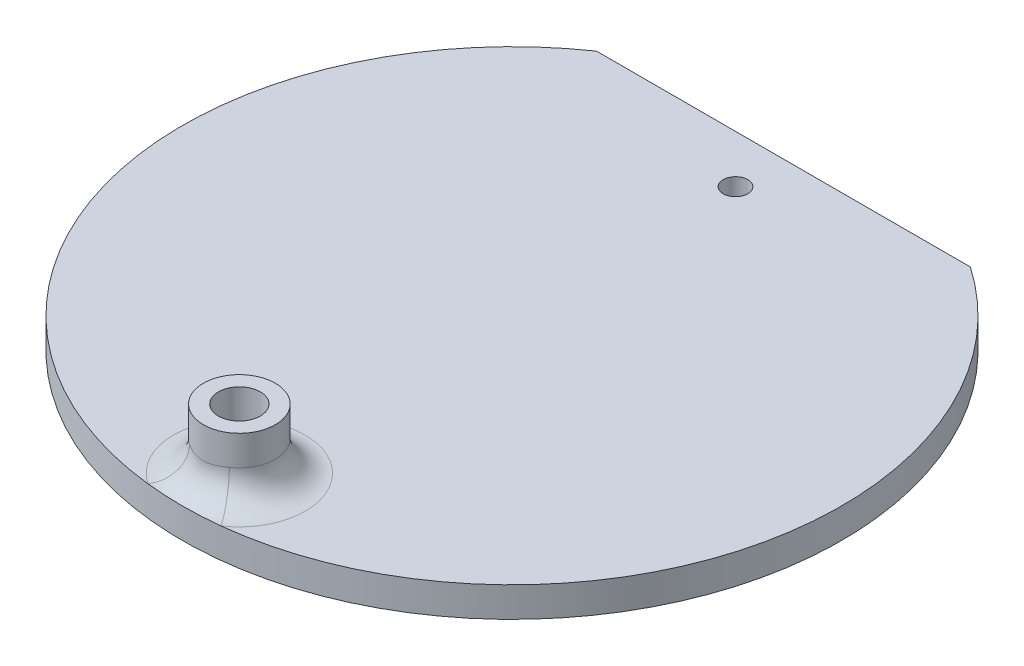
ISO-10303-21;
HEADER;
FILE_DESCRIPTION(('STEP AP214'),'2;1');
FILE_NAME('part.step','',(''),(''),'','','');
FILE_SCHEMA(('AUTOMOTIVE_DESIGN { 1 0 10303 214 1 1 1 1 }'));
ENDSEC;
DATA;
#1=APPLICATION_CONTEXT('core data for automotive mechanical design processes');
#2=APPLICATION_PROTOCOL_DEFINITION('international standard','automotive_design',2000,#1);
#3=PRODUCT_CONTEXT('',#1,'mechanical');
#4=PRODUCT('Part','Part','',(#3));
#5=PRODUCT_RELATED_PRODUCT_CATEGORY('part','',(#4));
#6=PRODUCT_DEFINITION_FORMATION('','',#4);
#7=PRODUCT_DEFINITION_CONTEXT('part definition',#1,'design');
#8=PRODUCT_DEFINITION('design','',#6,#7);
#9=PRODUCT_DEFINITION_SHAPE('','',#8);
#10=(LENGTH_UNIT() NAMED_UNIT(*) SI_UNIT(.MILLI.,.METRE.));
#11=(NAMED_UNIT(*) PLANE_ANGLE_UNIT() SI_UNIT($,.RADIAN.));
#12=(NAMED_UNIT(*) SI_UNIT($,.STERADIAN.) SOLID_ANGLE_UNIT());
#13=UNCERTAINTY_MEASURE_WITH_UNIT(LENGTH_MEASURE(1.E-05),#10,'distance_accuracy_value','');
#14=(GEOMETRIC_REPRESENTATION_CONTEXT(3) GLOBAL_UNCERTAINTY_ASSIGNED_CONTEXT((#13)) GLOBAL_UNIT_ASSIGNED_CONTEXT((#10,
#11,#12)) REPRESENTATION_CONTEXT('',''));
#15=CARTESIAN_POINT('',(0.,0.,0.));
#16=DIRECTION('',(0.,0.,1.));
#17=DIRECTION('',(1.,0.,0.));
#18=AXIS2_PLACEMENT_3D('',#15,#16,#17);
#19=CARTESIAN_POINT('',(0.,6.35,0.));
#20=DIRECTION('',(0.,1.,0.));
#21=DIRECTION('',(0.,0.,1.));
#22=AXIS2_PLACEMENT_3D('',#19,#20,#21);
#23=PLANE('',#22);
#24=CARTESIAN_POINT('',(0.,6.35,0.));
#25=DIRECTION('',(0.,1.,0.));
#26=DIRECTION('',(0.,0.,1.));
#27=AXIS2_PLACEMENT_3D('',#24,#25,#26);
#28=CIRCLE('',#27,69.85);
#29=CARTESIAN_POINT('',(-39.6132116723701,6.35,-57.531));
#30=VERTEX_POINT('',#29);
#31=CARTESIAN_POINT('',(-7.73096736621957,6.35,69.4208516483516));
#32=VERTEX_POINT('',#31);
#33=EDGE_CURVE('E93',#30,#32,#28,.T.);
#34=ORIENTED_EDGE('',*,*,#33,.T.);
#35=CARTESIAN_POINT('',(0.,6.35,57.785));
#36=DIRECTION('',(0.,1.,0.));
#37=DIRECTION('',(0.,0.,1.));
#38=AXIS2_PLACEMENT_3D('',#35,#36,#37);
#39=CIRCLE('',#38,13.97);
#40=CARTESIAN_POINT('',(7.73096736621957,6.35,69.4208516483516));
#41=VERTEX_POINT('',#40);
#42=EDGE_CURVE('E11',#32,#41,#39,.F.);
#43=ORIENTED_EDGE('',*,*,#42,.T.);
#44=CARTESIAN_POINT('',(39.6132116723701,6.35,-57.531));
#45=VERTEX_POINT('',#44);
#46=EDGE_CURVE('E102',#41,#45,#28,.T.);
#47=ORIENTED_EDGE('',*,*,#46,.T.);
#48=DIRECTION('',(-1.,0.,0.));
#49=VECTOR('',#48,1.);
#50=CARTESIAN_POINT('',(0.,6.35,-57.531));
#51=LINE('',#50,#49);
#52=EDGE_CURVE('E104',#45,#30,#51,.T.);
#53=ORIENTED_EDGE('',*,*,#52,.T.);
#54=EDGE_LOOP('',(#34,#43,#47,#53));
#55=FACE_BOUND('',#54,.T.);
#56=CARTESIAN_POINT('',(0.,6.35,-47.371));
#57=DIRECTION('',(0.,1.,0.));
#58=DIRECTION('',(0.,0.,1.));
#59=AXIS2_PLACEMENT_3D('',#56,#57,#58);
#60=CIRCLE('',#59,2.6035);
#61=CARTESIAN_POINT('',(0.,6.35,-44.7675));
#62=VERTEX_POINT('',#61);
#63=EDGE_CURVE('E176',#62,#62,#60,.T.);
#64=ORIENTED_EDGE('',*,*,#63,.F.);
#65=EDGE_LOOP('',(#64));
#66=FACE_BOUND('',#65,.T.);
#67=ADVANCED_FACE('F44',(#55,#66),#23,.T.);
#68=CARTESIAN_POINT('',(0.,0.,0.));
#69=DIRECTION('',(0.,1.,0.));
#70=DIRECTION('',(0.,0.,1.));
#71=AXIS2_PLACEMENT_3D('',#68,#69,#70);
#72=PLANE('',#71);
#73=CARTESIAN_POINT('',(0.,0.,57.785));
#74=DIRECTION('',(0.,1.,0.));
#75=DIRECTION('',(0.,0.,1.));
#76=AXIS2_PLACEMENT_3D('',#73,#74,#75);
#77=CIRCLE('',#76,4.445);
#78=CARTESIAN_POINT('',(0.,0.,62.23));
#79=VERTEX_POINT('',#78);
#80=EDGE_CURVE('E171',#79,#79,#77,.T.);
#81=ORIENTED_EDGE('',*,*,#80,.T.);
#82=EDGE_LOOP('',(#81));
#83=FACE_BOUND('',#82,.T.);
#84=CARTESIAN_POINT('',(0.,0.,0.));
#85=DIRECTION('',(0.,1.,0.));
#86=DIRECTION('',(0.,0.,1.));
#87=AXIS2_PLACEMENT_3D('',#84,#85,#86);
#88=CIRCLE('',#87,69.85);
#89=CARTESIAN_POINT('',(-39.6132116723701,0.,-57.531));
#90=VERTEX_POINT('',#89);
#91=CARTESIAN_POINT('',(39.6132116723701,0.,-57.531));
#92=VERTEX_POINT('',#91);
#93=EDGE_CURVE('E184',#90,#92,#88,.T.);
#94=ORIENTED_EDGE('',*,*,#93,.F.);
#95=DIRECTION('',(-1.,0.,0.));
#96=VECTOR('',#95,1.);
#97=CARTESIAN_POINT('',(0.,0.,-57.531));
#98=LINE('',#97,#96);
#99=EDGE_CURVE('E110',#92,#90,#98,.T.);
#100=ORIENTED_EDGE('',*,*,#99,.F.);
#101=EDGE_LOOP('',(#94,#100));
#102=FACE_BOUND('',#101,.T.);
#103=CARTESIAN_POINT('',(0.,0.,-47.371));
#104=DIRECTION('',(0.,1.,0.));
#105=DIRECTION('',(0.,0.,1.));
#106=AXIS2_PLACEMENT_3D('',#103,#104,#105);
#107=CIRCLE('',#106,2.6035);
#108=CARTESIAN_POINT('',(0.,0.,-44.7675));
#109=VERTEX_POINT('',#108);
#110=EDGE_CURVE('E170',#109,#109,#107,.T.);
#111=ORIENTED_EDGE('',*,*,#110,.T.);
#112=EDGE_LOOP('',(#111));
#113=FACE_BOUND('',#112,.T.);
#114=ADVANCED_FACE('F191',(#83,#102,#113),#72,.F.);
#115=CARTESIAN_POINT('',(0.,6.35,0.));
#116=DIRECTION('',(0.,-1.,0.));
#117=DIRECTION('',(0.,0.,-1.));
#118=AXIS2_PLACEMENT_3D('',#115,#116,#117);
#119=CYLINDRICAL_SURFACE('',#118,69.85);
#120=ORIENTED_EDGE('',*,*,#93,.T.);
#121=DIRECTION('',(0.,-1.,0.));
#122=VECTOR('',#121,1.);
#123=CARTESIAN_POINT('',(39.6132116723701,6.35,-57.531));
#124=LINE('',#123,#122);
#125=EDGE_CURVE('E100',#45,#92,#124,.T.);
#126=ORIENTED_EDGE('',*,*,#125,.F.);
#127=ORIENTED_EDGE('',*,*,#46,.F.);
#128=EDGE_CURVE('E98',#32,#41,#28,.T.);
#129=ORIENTED_EDGE('',*,*,#128,.F.);
#130=ORIENTED_EDGE('',*,*,#33,.F.);
#131=DIRECTION('',(0.,-1.,0.));
#132=VECTOR('',#131,1.);
#133=CARTESIAN_POINT('',(-39.6132116723701,6.35,-57.531));
#134=LINE('',#133,#132);
#135=EDGE_CURVE('E97',#30,#90,#134,.T.);
#136=ORIENTED_EDGE('',*,*,#135,.T.);
#137=EDGE_LOOP('',(#120,#126,#127,#129,#130,#136));
#138=FACE_BOUND('',#137,.T.);
#139=ADVANCED_FACE('F95',(#138),#119,.T.);
#140=CARTESIAN_POINT('',(0.,6.35,-57.531));
#141=DIRECTION('',(0.,0.,1.));
#142=DIRECTION('',(1.,0.,0.));
#143=AXIS2_PLACEMENT_3D('',#140,#141,#142);
#144=PLANE('',#143);
#145=ORIENTED_EDGE('',*,*,#99,.T.);
#146=ORIENTED_EDGE('',*,*,#135,.F.);
#147=ORIENTED_EDGE('',*,*,#52,.F.);
#148=ORIENTED_EDGE('',*,*,#125,.T.);
#149=EDGE_LOOP('',(#145,#146,#147,#148));
#150=FACE_BOUND('',#149,.T.);
#151=ADVANCED_FACE('F112',(#150),#144,.F.);
#152=CARTESIAN_POINT('',(0.,6.35,-47.371));
#153=DIRECTION('',(0.,-1.,0.));
#154=DIRECTION('',(0.,0.,-1.));
#155=AXIS2_PLACEMENT_3D('',#152,#153,#154);
#156=CYLINDRICAL_SURFACE('',#155,2.6035);
#157=ORIENTED_EDGE('',*,*,#63,.T.);
#158=EDGE_LOOP('',(#157));
#159=FACE_BOUND('',#158,.T.);
#160=ORIENTED_EDGE('',*,*,#110,.F.);
#161=EDGE_LOOP('',(#160));
#162=FACE_BOUND('',#161,.T.);
#163=ADVANCED_FACE('F164',(#159,#162),#156,.F.);
#164=CARTESIAN_POINT('',(0.,19.05,57.785));
#165=DIRECTION('',(0.,-1.,0.));
#166=DIRECTION('',(0.,0.,-1.));
#167=AXIS2_PLACEMENT_3D('',#164,#165,#166);
#168=CYLINDRICAL_SURFACE('',#167,7.62);
#169=CARTESIAN_POINT('',(0.,12.7,57.785));
#170=DIRECTION('',(0.,1.,0.));
#171=DIRECTION('',(0.,0.,1.));
#172=AXIS2_PLACEMENT_3D('',#169,#170,#171);
#173=CIRCLE('',#172,7.62);
#174=CARTESIAN_POINT('',(4.21689129066522,12.7,64.1318281718282));
#175=VERTEX_POINT('',#174);
#176=CARTESIAN_POINT('',(-4.21689129066522,12.7,64.1318281718282));
#177=VERTEX_POINT('',#176);
#178=EDGE_CURVE('E116',#175,#177,#173,.T.);
#179=ORIENTED_EDGE('',*,*,#178,.T.);
#180=CARTESIAN_POINT('',(-5.0502800203551,12.6241259743794,63.4910557056518));
#181=CARTESIAN_POINT('',(-4.58287021176565,5.4282200137874,63.9047478494736));
#182=CARTESIAN_POINT('',(-9.39041936822494,6.35,69.2159123618902));
#183=CARTESIAN_POINT('',(-4.97958814140895,12.639132884996,63.5536254079179));
#184=CARTESIAN_POINT('',(-4.56662716795478,5.52209542720465,63.9088874445371));
#185=CARTESIAN_POINT('',(-9.24585166176291,6.35,69.2355262158222));
#186=CARTESIAN_POINT('',(-4.90765468121129,12.6515537982243,63.6149463913229));
#187=CARTESIAN_POINT('',(-4.54563899541076,5.61379790743003,63.9186751360958));
#188=CARTESIAN_POINT('',(-9.09987377941315,6.35,69.2548688725613));
#189=CARTESIAN_POINT('',(-4.76145697446075,12.6718395305621,63.7349466384274));
#190=CARTESIAN_POINT('',(-4.49452659591923,5.79086695301502,63.9475503673709));
#191=CARTESIAN_POINT('',(-8.80534707652258,6.35,69.2929317816047));
#192=CARTESIAN_POINT('',(-4.68719325349465,12.6797053693847,63.7936264906639));
#193=CARTESIAN_POINT('',(-4.46451207723925,5.87634453856368,63.96652242559));
#194=CARTESIAN_POINT('',(-8.65679883906408,6.35,69.3116521723261));
#195=CARTESIAN_POINT('',(-4.46127444155936,12.6973871610747,63.9653865974726));
#196=CARTESIAN_POINT('',(-4.36193333484411,6.12096257251221,64.0338631061591));
#197=CARTESIAN_POINT('',(-8.20794722789748,6.35,69.366727257818));
#198=CARTESIAN_POINT('',(-4.30631505655565,12.7013216519482,64.0743437862816));
#199=CARTESIAN_POINT('',(-4.27608281451556,6.27219185492682,64.0930381269903));
#200=CARTESIAN_POINT('',(-7.90407602425096,6.35,69.4020450614639));
#201=CARTESIAN_POINT('',(-3.98909954411038,12.6979315314411,64.280166241492));
#202=CARTESIAN_POINT('',(-4.073023166554,6.54663103377165,64.2266136388869));
#203=CARTESIAN_POINT('',(-7.28920538698845,6.35,69.4693133969742));
#204=CARTESIAN_POINT('',(-3.82685856886076,12.6906293356943,64.3770551658829));
#205=CARTESIAN_POINT('',(-3.95634998189751,6.67075485196748,64.3007873009587));
#206=CARTESIAN_POINT('',(-6.97822136089688,6.35,69.5012704971945));
#207=CARTESIAN_POINT('',(-3.49570137875857,12.668718625116,64.5584869411558));
#208=CARTESIAN_POINT('',(-3.69603059990316,6.89343947364636,64.4539562109602));
#209=CARTESIAN_POINT('',(-6.34960547746602,6.35,69.5615175942693));
#210=CARTESIAN_POINT('',(-3.32678319348931,12.6541079385303,64.6430261125943));
#211=CARTESIAN_POINT('',(-3.55258564148113,6.99272193848332,64.5330361032906));
#212=CARTESIAN_POINT('',(-6.03197167100921,6.35,69.5898064979529));
#213=CARTESIAN_POINT('',(-2.97875553140354,12.6206187543188,64.8013317372832));
#214=CARTESIAN_POINT('',(-3.23924158205376,7.17080759393487,64.6901951583866));
#215=CARTESIAN_POINT('',(-5.3827894411415,6.35,69.6430678503981));
#216=CARTESIAN_POINT('',(-2.79949516026513,12.6016388951796,64.8747597602943));
#217=CARTESIAN_POINT('',(-3.06866365219938,7.24966054152045,64.7684797730907));
#218=CARTESIAN_POINT('',(-5.05109416435232,6.35,69.6679345720988));
#219=CARTESIAN_POINT('',(-2.43592554354589,12.5629253484304,65.0077512022909));
#220=CARTESIAN_POINT('',(-2.7084829045359,7.38672946703421,64.915765934316));
#221=CARTESIAN_POINT('',(-4.38280590392311,6.35,69.7131671938935));
#222=CARTESIAN_POINT('',(-2.25161621263059,12.5431916480771,65.0673143867796));
#223=CARTESIAN_POINT('',(-2.5186516504076,7.44540596571795,64.9850895570437));
#224=CARTESIAN_POINT('',(-4.04621283754871,6.35,69.7335330178631));
#225=CARTESIAN_POINT('',(-1.87890253100791,12.5057667905719,65.1722600756452));
#226=CARTESIAN_POINT('',(-2.12437840495361,7.54518002027902,65.1101026082231));
#227=CARTESIAN_POINT('',(-3.36900596764924,6.35,69.7695297803105));
#228=CARTESIAN_POINT('',(-1.69049744492118,12.4880760038782,65.2176400105959));
#229=CARTESIAN_POINT('',(-1.91953858008165,7.58659799888197,65.1661068437848));
#230=CARTESIAN_POINT('',(-3.02839144718598,6.35,69.785159860849));
#231=CARTESIAN_POINT('',(-1.31066457817653,12.4569921371102,65.2939337522816));
#232=CARTESIAN_POINT('',(-1.49958526251014,7.65435299584038,65.2614730650407));
#233=CARTESIAN_POINT('',(-2.34418466961088,6.35,69.8114927704761));
#234=CARTESIAN_POINT('',(-1.11923660843084,12.4435993270097,65.3248466503377));
#235=CARTESIAN_POINT('',(-1.28395024260967,7.6809002356595,65.3010964096131));
#236=CARTESIAN_POINT('',(-2.00059222683503,6.35,69.8221952900625));
#237=CARTESIAN_POINT('',(-0.714502876427093,12.4216542739926,65.3744428866253));
#238=CARTESIAN_POINT('',(-0.824050000144775,7.72278402608345,65.364934737237));
#239=CARTESIAN_POINT('',(-1.27574354860586,6.35,69.8393845866783));
#240=CARTESIAN_POINT('',(-0.500987954707512,12.4137484517281,65.3915245354514));
#241=CARTESIAN_POINT('',(-0.578234602824707,7.73683514198171,65.387363804503));
#242=CARTESIAN_POINT('',(-0.894278369258301,6.35,69.8453187349475));
#243=CARTESIAN_POINT('',(-0.073224648881594,12.4062925773587,65.407654033547));
#244=CARTESIAN_POINT('',(-0.0849688473671192,7.75006685960819,65.40845738778));
#245=CARTESIAN_POINT('',(-0.13061044207827,6.35,69.85092174033));
#246=CARTESIAN_POINT('',(0.141023779861692,12.4067430431413,65.4067007650882));
#247=CARTESIAN_POINT('',(0.163361793154023,7.7492940190104,65.4071962144744));
#248=CARTESIAN_POINT('',(0.251592350000527,6.35,69.8505902091229));
#249=CARTESIAN_POINT('',(0.568777545761017,12.4159373457082,65.3867608025428));
#250=CARTESIAN_POINT('',(0.656227265846094,7.73290870621274,65.381143404507));
#251=CARTESIAN_POINT('',(1.01537781393756,6.35,69.8436644568301));
#252=CARTESIAN_POINT('',(0.782282247047944,12.4246870727081,65.3677613005312));
#253=CARTESIAN_POINT('',(0.901636984945812,7.71722674468583,65.3562414537932));
#254=CARTESIAN_POINT('',(1.3969598525406,6.35,69.8370657877789));
#255=CARTESIAN_POINT('',(1.20680616991194,12.4492358351871,65.3118756001176));
#256=CARTESIAN_POINT('',(1.38294207791571,7.6697955005943,65.2844725476715));
#257=CARTESIAN_POINT('',(2.15765867994539,6.35,69.8177038661369));
#258=CARTESIAN_POINT('',(1.41782543612611,12.4650347438679,65.2749897234486));
#259=CARTESIAN_POINT('',(1.61964467817082,7.63787163484625,65.2373545425727));
#260=CARTESIAN_POINT('',(2.53677551296598,6.35,69.8049407244303));
#261=CARTESIAN_POINT('',(1.83090814532072,12.5009123589325,65.1847166478995));
#262=CARTESIAN_POINT('',(2.07256208316772,7.55659717500115,65.1255331832209));
#263=CARTESIAN_POINT('',(3.28211943710771,6.35,69.7738203440359));
#264=CARTESIAN_POINT('',(2.03306519252386,12.5208801896105,65.131743318621));
#265=CARTESIAN_POINT('',(2.28980883144517,7.50737430827154,65.0609107975572));
#266=CARTESIAN_POINT('',(3.64843848802951,6.35,69.7556035574616));
#267=CARTESIAN_POINT('',(2.43231251883262,12.562288254713,65.0093925978036));
#268=CARTESIAN_POINT('',(2.70496449554559,7.38832187730075,64.917891930975));
#269=CARTESIAN_POINT('',(4.37615554107455,6.35,69.7137331824397));
#270=CARTESIAN_POINT('',(2.62940265700619,12.5837285300315,64.9400147505322));
#271=CARTESIAN_POINT('',(2.90331077884139,7.3180373281554,64.8390872513143));
#272=CARTESIAN_POINT('',(4.73755340618772,6.35,69.690079442949));
#273=CARTESIAN_POINT('',(3.01696788852798,12.6243216795735,64.7854117625014));
#274=CARTESIAN_POINT('',(3.27515557320106,7.15339075705832,64.6739615149143));
#275=CARTESIAN_POINT('',(5.45365632140196,6.35,69.6376968422985));
#276=CARTESIAN_POINT('',(3.20745317975357,12.6434782026543,64.700212473066));
#277=CARTESIAN_POINT('',(3.44889066344234,7.05841645714903,64.5872670144566));
#278=CARTESIAN_POINT('',(5.80837126425412,6.35,69.6089762638335));
#279=CARTESIAN_POINT('',(3.58091647673466,12.6751981019938,64.5144068844836));
#280=CARTESIAN_POINT('',(3.76653943258153,6.84062697426207,64.414744327521));
#281=CARTESIAN_POINT('',(6.51044078405137,6.35,69.5468244407591));
#282=CARTESIAN_POINT('',(3.7638957743009,12.6877626171883,64.4138032507092));
#283=CARTESIAN_POINT('',(3.91034491929089,6.7169418154525,64.3286751493764));
#284=CARTESIAN_POINT('',(6.85779662250907,6.35,69.5133940111623));
#285=CARTESIAN_POINT('',(4.08653142436797,12.6999965509165,64.2187393363377));
#286=CARTESIAN_POINT('',(4.13786240094363,6.46623643972809,64.1848931380646));
#287=CARTESIAN_POINT('',(7.47734237382274,6.35,69.449184470466));
#288=CARTESIAN_POINT('',(4.22772420417335,12.7016893827022,64.1268516602233));
#289=CARTESIAN_POINT('',(4.22794269869977,6.34340200570889,64.1247053696028));
#290=CARTESIAN_POINT('',(7.7510810139108,6.35,69.4191423197561));
#291=CARTESIAN_POINT('',(4.5036114801049,12.6945770536302,63.9340000789325));
#292=CARTESIAN_POINT('',(4.38248377742812,6.07706749251832,64.0207054950089));
#293=CARTESIAN_POINT('',(8.29172925813672,6.35,69.3566417298483));
#294=CARTESIAN_POINT('',(4.63830910489847,12.6857770007511,63.8330406120556));
#295=CARTESIAN_POINT('',(4.44653874025811,5.93293986521032,63.9771487752968));
#296=CARTESIAN_POINT('',(8.55864212050295,6.35,69.324184473543));
#297=CARTESIAN_POINT('',(4.90097122186047,12.6543761076303,63.6222330835039));
#298=CARTESIAN_POINT('',(4.54691716400548,5.62425995941098,63.9164352158475));
#299=CARTESIAN_POINT('',(9.08557469505443,6.35,69.2570971373856));
#300=CARTESIAN_POINT('',(5.02890753496898,12.6317218056543,63.5123520261328));
#301=CARTESIAN_POINT('',(4.58253645809981,5.45899771860822,63.8999661549804));
#302=CARTESIAN_POINT('',(9.34556361281613,6.35,69.2224591090063));
#303=CARTESIAN_POINT('',(5.27672408601374,12.5688133843937,63.2849164511477));
#304=CARTESIAN_POINT('',(4.62500834702647,5.11290432949592,63.9057950683076));
#305=CARTESIAN_POINT('',(9.85625988575395,6.35,69.151599066015));
#306=CARTESIAN_POINT('',(5.3965921096863,12.5285332440525,63.1673508078778));
#307=CARTESIAN_POINT('',(4.63110895104679,4.93155707688981,63.9291250973976));
#308=CARTESIAN_POINT('',(10.1069529215811,6.35,69.1153747810354));
#309=CARTESIAN_POINT('',(5.51185559837216,12.4775890052431,63.0465442469577));
#310=CARTESIAN_POINT('',(4.62234634245827,4.74787104056298,63.9783707872073));
#311=CARTESIAN_POINT('',(10.3519563145377,6.35,69.0786472107112));
#312=(BOUNDED_SURFACE() B_SPLINE_SURFACE(3,2,((#180,#181,#182),(#183,#184,#185),(#186,#187,
#188),(#189,#190,#191),(#192,#193,#194),(#195,#196,#197),(#198,#199,#200),(#201,#202,#203),
(#204,#205,#206),(#207,#208,#209),(#210,#211,#212),(#213,#214,#215),(#216,#217,#218),(#219,#220,
#221),(#222,#223,#224),(#225,#226,#227),(#228,#229,#230),(#231,#232,#233),(#234,#235,#236),
(#237,#238,#239),(#240,#241,#242),(#243,#244,#245),(#246,#247,#248),(#249,#250,#251),(#252,#253,
#254),(#255,#256,#257),(#258,#259,#260),(#261,#262,#263),(#264,#265,#266),(#267,#268,#269),
(#270,#271,#272),(#273,#274,#275),(#276,#277,#278),(#279,#280,#281),(#282,#283,#284),(#285,#286,
#287),(#288,#289,#290),(#291,#292,#293),(#294,#295,#296),(#297,#298,#299),(#300,#301,#302),
(#303,#304,#305),(#306,#307,#308),(#309,#310,#311)),.UNSPECIFIED.,.F.,.F.,
.F.) B_SPLINE_SURFACE_WITH_KNOTS((4,2,2,2,2,2,2,2,2,2,2,2,2,2,2,2,2,2,2,2,2,4),(3,3),(0.,
0.521062725444504,1.04200875901152,2.08260384262689,3.12112577258556,4.15995648794662,
5.22587833769022,6.29181821413255,7.35795108362519,8.42415090825349,9.60097606765471,
10.7778741619705,11.9556081589536,13.1333209721055,14.282988448928,15.4326878683153,
16.5805250154679,17.7281637793928,18.653926445641,19.5792386308094,20.5081442048779,
21.4384257750674),(0.,1.),
.UNSPECIFIED.) GEOMETRIC_REPRESENTATION_ITEM() RATIONAL_B_SPLINE_SURFACE(((1.,0.660265917400168,
1.),(1.,0.664701730531369,1.),(1.,0.66909355515777,1.),(1.,0.677762100023741,1.),(1.,
0.682038845820647,1.),(1.,0.694648277763913,1.),(1.,0.702771329370346,1.),(1.,0.71827430892158,
1.),(1.,0.725655685132809,1.),(1.,0.739581160208816,1.),(1.,0.746125009472009,1.),(1.,
0.758444799164925,1.),(1.,0.764196263302985,1.),(1.,0.774653522925992,1.),(1.,0.779359300725114,
1.),(1.,0.787672221359211,1.),(1.,0.791279165127288,1.),(1.,0.797353113420314,1.),(1.,
0.799820046340722,1.),(1.,0.803781084452177,1.),(1.,0.805147694654952,1.),(1.,0.806438066896808,
1.),(1.,0.806361739508684,1.),(1.,0.80476668379113,1.),(1.,0.803246931021705,1.),(1.,
0.798784818391152,1.),(1.,0.795842484118866,1.),(1.,0.788662419443567,1.),(1.,0.784457205347708,
1.),(1.,0.774784388293355,1.),(1.,0.769316750263671,1.),(1.,0.757202897197033,1.),(1.,
0.750558605553516,1.),(1.,0.736184283774225,1.),(1.,0.728454441487503,1.),(1.,0.713632907609569,
1.),(1.,0.706706763049178,1.),(1.,0.692338515978818,1.),(1.,0.684896666176759,1.),(1.,
0.669590786096322,1.),(1.,0.66172522853887,1.),(1.,0.645770036891432,1.),(1.,0.637680088134084,
1.),(1.,0.629575751085972,1.))) REPRESENTATION_ITEM('') SURFACE());
#313=CARTESIAN_POINT('',(-5.0502800203551,12.6241259743794,63.4910557056518));
#314=CARTESIAN_POINT('',(-4.97958814140895,12.639132884996,63.5536254079179));
#315=CARTESIAN_POINT('',(-4.90765468121129,12.6515537982243,63.6149463913229));
#316=CARTESIAN_POINT('',(-4.76145697446075,12.6718395305621,63.7349466384274));
#317=CARTESIAN_POINT('',(-4.68719325349465,12.6797053693847,63.7936264906639));
#318=CARTESIAN_POINT('',(-4.46127444155936,12.6973871610747,63.9653865974726));
#319=CARTESIAN_POINT('',(-4.30631505655565,12.7013216519482,64.0743437862816));
#320=CARTESIAN_POINT('',(-3.98909954411038,12.6979315314411,64.280166241492));
#321=CARTESIAN_POINT('',(-3.82685856886076,12.6906293356943,64.3770551658829));
#322=CARTESIAN_POINT('',(-3.49570137875857,12.668718625116,64.5584869411558));
#323=CARTESIAN_POINT('',(-3.32678319348931,12.6541079385303,64.6430261125943));
#324=CARTESIAN_POINT('',(-2.97875553140354,12.6206187543188,64.8013317372832));
#325=CARTESIAN_POINT('',(-2.79949516026513,12.6016388951796,64.8747597602943));
#326=CARTESIAN_POINT('',(-2.43592554354589,12.5629253484304,65.0077512022909));
#327=CARTESIAN_POINT('',(-2.25161621263059,12.5431916480771,65.0673143867796));
#328=CARTESIAN_POINT('',(-1.87890253100791,12.5057667905719,65.1722600756452));
#329=CARTESIAN_POINT('',(-1.69049744492118,12.4880760038782,65.2176400105959));
#330=CARTESIAN_POINT('',(-1.31066457817653,12.4569921371102,65.2939337522816));
#331=CARTESIAN_POINT('',(-1.11923660843084,12.4435993270097,65.3248466503377));
#332=CARTESIAN_POINT('',(-0.714502876427093,12.4216542739926,65.3744428866252));
#333=CARTESIAN_POINT('',(-0.500987954707512,12.4137484517281,65.3915245354514));
#334=CARTESIAN_POINT('',(-0.0732246488815939,12.4062925773587,65.407654033547));
#335=CARTESIAN_POINT('',(0.141023779861692,12.4067430431413,65.4067007650882));
#336=CARTESIAN_POINT('',(0.568777545761017,12.4159373457082,65.3867608025428));
#337=CARTESIAN_POINT('',(0.782282247047944,12.4246870727081,65.3677613005312));
#338=CARTESIAN_POINT('',(1.20680616991194,12.4492358351871,65.3118756001176));
#339=CARTESIAN_POINT('',(1.41782543612611,12.4650347438678,65.2749897234486));
#340=CARTESIAN_POINT('',(1.83090814532072,12.5009123589325,65.1847166478995));
#341=CARTESIAN_POINT('',(2.03306519252386,12.5208801896105,65.131743318621));
#342=CARTESIAN_POINT('',(2.43231251883262,12.562288254713,65.0093925978036));
#343=CARTESIAN_POINT('',(2.62940265700619,12.5837285300315,64.9400147505322));
#344=CARTESIAN_POINT('',(3.01696788852798,12.6243216795735,64.7854117625014));
#345=CARTESIAN_POINT('',(3.20745317975357,12.6434782026543,64.700212473066));
#346=CARTESIAN_POINT('',(3.58091647673466,12.6751981019938,64.5144068844836));
#347=CARTESIAN_POINT('',(3.7638957743009,12.6877626171883,64.4138032507092));
#348=CARTESIAN_POINT('',(4.08653142436797,12.6999965509165,64.2187393363377));
#349=CARTESIAN_POINT('',(4.22772420417335,12.7016893827022,64.1268516602233));
#350=CARTESIAN_POINT('',(4.5036114801049,12.6945770536302,63.9340000789325));
#351=CARTESIAN_POINT('',(4.63830910489847,12.6857770007511,63.8330406120556));
#352=CARTESIAN_POINT('',(4.90097122186047,12.6543761076303,63.6222330835039));
#353=CARTESIAN_POINT('',(5.02890753496898,12.6317218056543,63.5123520261328));
#354=CARTESIAN_POINT('',(5.27672408601374,12.5688133843937,63.2849164511477));
#355=CARTESIAN_POINT('',(5.3965921096863,12.5285332440525,63.1673508078778));
#356=CARTESIAN_POINT('',(5.51185559837216,12.4775890052431,63.0465442469577));
#357=B_SPLINE_CURVE_WITH_KNOTS('',3,(#313,#314,#315,#316,#317,#318,#319,#320,#321,#322,#323,
#324,#325,#326,#327,#328,#329,#330,#331,#332,#333,#334,#335,#336,#337,#338,#339,#340,#341,#342,
#343,#344,#345,#346,#347,#348,#349,#350,#351,#352,#353,#354,#355,#356),.UNSPECIFIED.,.F.,.F.,(4,
2,2,2,2,2,2,2,2,2,2,2,2,2,2,2,2,2,2,2,2,4),(0.,0.521062725444504,1.04200875901152,
2.08260384262689,3.12112577258556,4.15995648794662,5.22587833769022,6.29181821413255,
7.35795108362519,8.42415090825349,9.60097606765471,10.7778741619705,11.9556081589536,
13.1333209721055,14.282988448928,15.4326878683153,16.5805250154679,17.7281637793928,
18.653926445641,19.5792386308094,20.5081442048779,21.4384257750674),.UNSPECIFIED.);
#358=EDGE_CURVE('E59',#177,#175,#357,.T.);
#359=ORIENTED_EDGE('',*,*,#358,.T.);
#360=EDGE_LOOP('',(#179,#359));
#361=FACE_BOUND('',#360,.T.);
#362=CARTESIAN_POINT('',(0.,19.05,57.785));
#363=DIRECTION('',(0.,1.,0.));
#364=DIRECTION('',(0.,0.,1.));
#365=AXIS2_PLACEMENT_3D('',#362,#363,#364);
#366=CIRCLE('',#365,7.62);
#367=CARTESIAN_POINT('',(0.,19.05,65.405));
#368=VERTEX_POINT('',#367);
#369=EDGE_CURVE('E167',#368,#368,#366,.T.);
#370=ORIENTED_EDGE('',*,*,#369,.F.);
#371=EDGE_LOOP('',(#370));
#372=FACE_BOUND('',#371,.T.);
#373=ADVANCED_FACE('F133',(#361,#372),#168,.T.);
#374=CARTESIAN_POINT('',(0.,19.05,57.785));
#375=DIRECTION('',(0.,1.,0.));
#376=DIRECTION('',(0.,0.,1.));
#377=AXIS2_PLACEMENT_3D('',#374,#375,#376);
#378=PLANE('',#377);
#379=CARTESIAN_POINT('',(0.,19.05,57.785));
#380=DIRECTION('',(0.,1.,0.));
#381=DIRECTION('',(0.,0.,1.));
#382=AXIS2_PLACEMENT_3D('',#379,#380,#381);
#383=CIRCLE('',#382,4.445);
#384=CARTESIAN_POINT('',(0.,19.05,62.23));
#385=VERTEX_POINT('',#384);
#386=EDGE_CURVE('E154',#385,#385,#383,.T.);
#387=ORIENTED_EDGE('',*,*,#386,.F.);
#388=EDGE_LOOP('',(#387));
#389=FACE_BOUND('',#388,.T.);
#390=ORIENTED_EDGE('',*,*,#369,.T.);
#391=EDGE_LOOP('',(#390));
#392=FACE_BOUND('',#391,.T.);
#393=ADVANCED_FACE('F163',(#389,#392),#378,.T.);
#394=CARTESIAN_POINT('',(0.,0.,57.785));
#395=DIRECTION('',(0.,1.,0.));
#396=DIRECTION('',(0.,0.,1.));
#397=AXIS2_PLACEMENT_3D('',#394,#395,#396);
#398=CYLINDRICAL_SURFACE('',#397,4.445);
#399=ORIENTED_EDGE('',*,*,#80,.F.);
#400=EDGE_LOOP('',(#399));
#401=FACE_BOUND('',#400,.T.);
#402=ORIENTED_EDGE('',*,*,#386,.T.);
#403=EDGE_LOOP('',(#402));
#404=FACE_BOUND('',#403,.T.);
#405=ADVANCED_FACE('F210',(#401,#404),#398,.F.);
#406=CARTESIAN_POINT('',(0.,12.7,57.785));
#407=DIRECTION('',(0.,1.,0.));
#408=DIRECTION('',(0.,0.,1.));
#409=AXIS2_PLACEMENT_3D('',#406,#407,#408);
#410=TOROIDAL_SURFACE('',#409,13.97,6.35);
#411=CARTESIAN_POINT('',(7.73096736621957,12.7,69.4208516483516));
#412=DIRECTION('',(0.832917082917083,0.,-0.553397807173914));
#413=DIRECTION('',(-0.553397807173914,0.,-0.832917082917083));
#414=AXIS2_PLACEMENT_3D('',#411,#412,#413);
#415=CIRCLE('',#414,6.35);
#416=EDGE_CURVE('E155',#41,#175,#415,.T.);
#417=ORIENTED_EDGE('',*,*,#416,.F.);
#418=ORIENTED_EDGE('',*,*,#42,.F.);
#419=CARTESIAN_POINT('',(-7.73096736621956,12.7,69.4208516483517));
#420=DIRECTION('',(-0.832917082917085,0.,-0.553397807173912));
#421=DIRECTION('',(-0.553397807173912,0.,0.832917082917085));
#422=AXIS2_PLACEMENT_3D('',#419,#420,#421);
#423=CIRCLE('',#422,6.35);
#424=EDGE_CURVE('E73',#177,#32,#423,.T.);
#425=ORIENTED_EDGE('',*,*,#424,.F.);
#426=ORIENTED_EDGE('',*,*,#178,.F.);
#427=EDGE_LOOP('',(#417,#418,#425,#426));
#428=FACE_BOUND('',#427,.T.);
#429=ADVANCED_FACE('F46',(#428),#410,.F.);
#430=ORIENTED_EDGE('',*,*,#424,.T.);
#431=ORIENTED_EDGE('',*,*,#128,.T.);
#432=ORIENTED_EDGE('',*,*,#416,.T.);
#433=ORIENTED_EDGE('',*,*,#358,.F.);
#434=EDGE_LOOP('',(#430,#431,#432,#433));
#435=FACE_BOUND('',#434,.T.);
#436=ADVANCED_FACE('F142',(#435),#312,.F.);
#437=CLOSED_SHELL('',(#67,#114,#139,#151,#163,#373,#393,#405,#429,#436));
#438=MANIFOLD_SOLID_BREP('B2',#437);
#439=ADVANCED_BREP_SHAPE_REPRESENTATION('',(#18,#438),#14);
#440=SHAPE_DEFINITION_REPRESENTATION(#9,#439);
ENDSEC;
END-ISO-10303-21;
